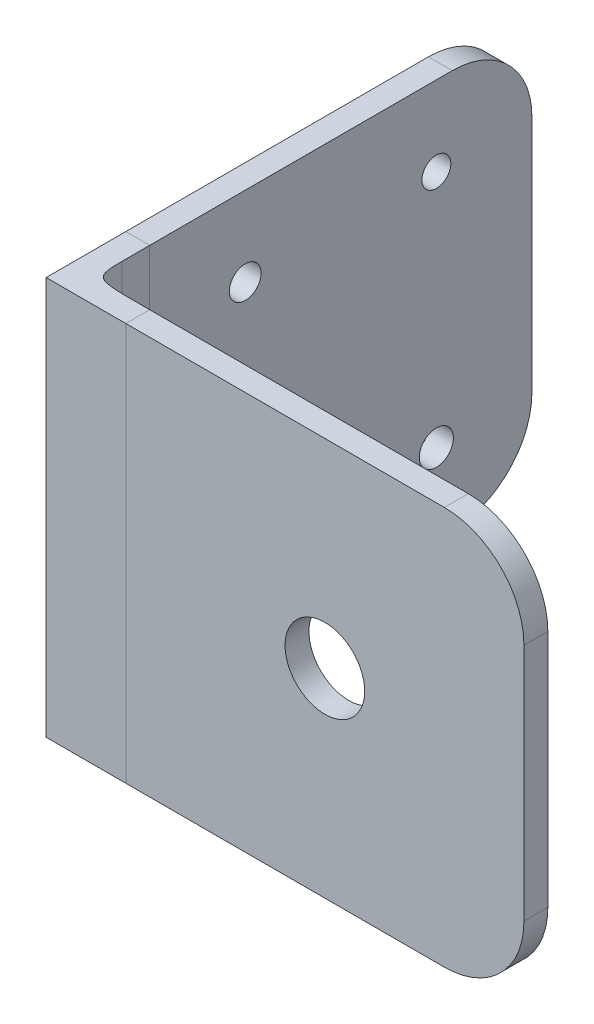
ISO-10303-21;
HEADER;
FILE_DESCRIPTION(('STEP AP214'),'2;1');
FILE_NAME('part.step','',(''),(''),'','','');
FILE_SCHEMA(('AUTOMOTIVE_DESIGN { 1 0 10303 214 1 1 1 1 }'));
ENDSEC;
DATA;
#1=APPLICATION_CONTEXT('core data for automotive mechanical design processes');
#2=APPLICATION_PROTOCOL_DEFINITION('international standard','automotive_design',2000,#1);
#3=PRODUCT_CONTEXT('',#1,'mechanical');
#4=PRODUCT('Part','Part','',(#3));
#5=PRODUCT_RELATED_PRODUCT_CATEGORY('part','',(#4));
#6=PRODUCT_DEFINITION_FORMATION('','',#4);
#7=PRODUCT_DEFINITION_CONTEXT('part definition',#1,'design');
#8=PRODUCT_DEFINITION('design','',#6,#7);
#9=PRODUCT_DEFINITION_SHAPE('','',#8);
#10=(LENGTH_UNIT() NAMED_UNIT(*) SI_UNIT(.MILLI.,.METRE.));
#11=(NAMED_UNIT(*) PLANE_ANGLE_UNIT() SI_UNIT($,.RADIAN.));
#12=(NAMED_UNIT(*) SI_UNIT($,.STERADIAN.) SOLID_ANGLE_UNIT());
#13=UNCERTAINTY_MEASURE_WITH_UNIT(LENGTH_MEASURE(1.E-05),#10,'distance_accuracy_value','');
#14=(GEOMETRIC_REPRESENTATION_CONTEXT(3) GLOBAL_UNCERTAINTY_ASSIGNED_CONTEXT((#13)) GLOBAL_UNIT_ASSIGNED_CONTEXT((#10,
#11,#12)) REPRESENTATION_CONTEXT('',''));
#15=CARTESIAN_POINT('',(0.,0.,0.));
#16=DIRECTION('',(0.,0.,1.));
#17=DIRECTION('',(1.,0.,0.));
#18=AXIS2_PLACEMENT_3D('',#15,#16,#17);
#19=CARTESIAN_POINT('',(-21.4649081505494,-14.4566204002042,5.00000000002137));
#20=DIRECTION('',(1.,0.,0.));
#21=DIRECTION('',(0.,0.,-1.));
#22=AXIS2_PLACEMENT_3D('',#19,#20,#21);
#23=PLANE('',#22);
#24=DIRECTION('',(0.,1.,0.));
#25=VECTOR('',#24,1.);
#26=CARTESIAN_POINT('',(-21.4649081505494,25.5433795997958,43.0000000000214));
#27=LINE('',#26,#25);
#28=CARTESIAN_POINT('',(-21.4649081505494,-24.4566204002042,43.0000000000214));
#29=VERTEX_POINT('',#28);
#30=CARTESIAN_POINT('',(-21.4649081505494,25.5433795997958,43.0000000000214));
#31=VERTEX_POINT('',#30);
#32=EDGE_CURVE('P0_E113',#29,#31,#27,.T.);
#33=ORIENTED_EDGE('',*,*,#32,.T.);
#34=DIRECTION('',(0.,0.,-1.));
#35=VECTOR('',#34,1.);
#36=CARTESIAN_POINT('',(-21.4649081505494,25.5433795997958,5.00000000002143));
#37=LINE('',#36,#35);
#38=CARTESIAN_POINT('',(-21.4649081505494,25.5433795997958,5.00000000002144));
#39=VERTEX_POINT('',#38);
#40=EDGE_CURVE('P0_E71',#31,#39,#37,.T.);
#41=ORIENTED_EDGE('',*,*,#40,.T.);
#42=CARTESIAN_POINT('',(-21.4649081505494,15.5433795997958,5.00000000002136));
#43=DIRECTION('',(-1.,0.,0.));
#44=DIRECTION('',(0.,0.,-1.));
#45=AXIS2_PLACEMENT_3D('',#42,#43,#44);
#46=CIRCLE('',#45,10.);
#47=CARTESIAN_POINT('',(-21.4649081505494,15.5433795997958,-4.99999999997864));
#48=VERTEX_POINT('',#47);
#49=EDGE_CURVE('P0_E84',#39,#48,#46,.T.);
#50=ORIENTED_EDGE('',*,*,#49,.T.);
#51=DIRECTION('',(0.,-1.,0.));
#52=VECTOR('',#51,1.);
#53=CARTESIAN_POINT('',(-21.4649081505494,15.5433795997958,-4.99999999997864));
#54=LINE('',#53,#52);
#55=CARTESIAN_POINT('',(-21.4649081505494,-14.4566204002042,-4.99999999997864));
#56=VERTEX_POINT('',#55);
#57=EDGE_CURVE('P0_E78',#48,#56,#54,.T.);
#58=ORIENTED_EDGE('',*,*,#57,.T.);
#59=CARTESIAN_POINT('',(-21.4649081505494,-14.4566204002042,5.00000000002137));
#60=DIRECTION('',(-1.,0.,0.));
#61=DIRECTION('',(0.,0.,-1.));
#62=AXIS2_PLACEMENT_3D('',#59,#60,#61);
#63=CIRCLE('',#62,10.);
#64=CARTESIAN_POINT('',(-21.4649081505494,-24.4566204002042,5.00000000002144));
#65=VERTEX_POINT('',#64);
#66=EDGE_CURVE('P0_E82',#56,#65,#63,.T.);
#67=ORIENTED_EDGE('',*,*,#66,.T.);
#68=DIRECTION('',(0.,0.,1.));
#69=VECTOR('',#68,1.);
#70=CARTESIAN_POINT('',(-21.4649081505494,-24.4566204002042,5.00000000002144));
#71=LINE('',#70,#69);
#72=EDGE_CURVE('P0_E34',#65,#29,#71,.T.);
#73=ORIENTED_EDGE('',*,*,#72,.T.);
#74=EDGE_LOOP('',(#33,#41,#50,#58,#67,#73));
#75=FACE_BOUND('',#74,.T.);
#76=CARTESIAN_POINT('',(-21.4649081505494,15.5433795997958,7.00000000002137));
#77=DIRECTION('',(-1.,0.,0.));
#78=DIRECTION('',(0.,0.,1.));
#79=AXIS2_PLACEMENT_3D('',#76,#77,#78);
#80=CIRCLE('',#79,1.8144674489946);
#81=CARTESIAN_POINT('',(-21.4649081505494,15.5433795997958,8.81446744901597));
#82=VERTEX_POINT('',#81);
#83=EDGE_CURVE('P0_E106',#82,#82,#80,.T.);
#84=ORIENTED_EDGE('',*,*,#83,.F.);
#85=EDGE_LOOP('',(#84));
#86=FACE_BOUND('',#85,.T.);
#87=CARTESIAN_POINT('',(-21.4649081505494,15.5433795997958,31.0000000000214));
#88=DIRECTION('',(-1.,0.,0.));
#89=DIRECTION('',(0.,0.,1.));
#90=AXIS2_PLACEMENT_3D('',#87,#88,#89);
#91=CIRCLE('',#90,1.99577898309595);
#92=CARTESIAN_POINT('',(-21.4649081505494,15.5433795997958,32.9957789831173));
#93=VERTEX_POINT('',#92);
#94=EDGE_CURVE('P0_E178',#93,#93,#91,.T.);
#95=ORIENTED_EDGE('',*,*,#94,.F.);
#96=EDGE_LOOP('',(#95));
#97=FACE_BOUND('',#96,.T.);
#98=CARTESIAN_POINT('',(-21.4649081505494,-14.4566204002042,7.00000000002137));
#99=DIRECTION('',(-1.,0.,0.));
#100=DIRECTION('',(0.,0.,1.));
#101=AXIS2_PLACEMENT_3D('',#98,#99,#100);
#102=CIRCLE('',#101,2.14187305226892);
#103=CARTESIAN_POINT('',(-21.4649081505494,-14.4566204002042,9.14187305229028));
#104=VERTEX_POINT('',#103);
#105=EDGE_CURVE('P0_E172',#104,#104,#102,.T.);
#106=ORIENTED_EDGE('',*,*,#105,.F.);
#107=EDGE_LOOP('',(#106));
#108=FACE_BOUND('',#107,.T.);
#109=CARTESIAN_POINT('',(-21.4649081505494,-14.4566204002042,31.0000000000214));
#110=DIRECTION('',(-1.,0.,0.));
#111=DIRECTION('',(0.,0.,1.));
#112=AXIS2_PLACEMENT_3D('',#109,#110,#111);
#113=CIRCLE('',#112,1.87301364959167);
#114=CARTESIAN_POINT('',(-21.4649081505494,-14.4566204002042,32.873013649613));
#115=VERTEX_POINT('',#114);
#116=EDGE_CURVE('P0_E163',#115,#115,#113,.T.);
#117=ORIENTED_EDGE('',*,*,#116,.F.);
#118=EDGE_LOOP('',(#117));
#119=FACE_BOUND('',#118,.T.);
#120=ADVANCED_FACE('P0_F17',(#75,#86,#97,#108,#119),#23,.F.);
#121=CARTESIAN_POINT('',(-18.4649081505494,-14.4566204002042,5.00000000002137));
#122=DIRECTION('',(1.,0.,0.));
#123=DIRECTION('',(0.,0.,-1.));
#124=AXIS2_PLACEMENT_3D('',#121,#122,#123);
#125=PLANE('',#124);
#126=CARTESIAN_POINT('',(-18.4649081505494,-14.4566204002042,7.00000000002137));
#127=DIRECTION('',(-1.,0.,0.));
#128=DIRECTION('',(0.,0.,1.));
#129=AXIS2_PLACEMENT_3D('',#126,#127,#128);
#130=CIRCLE('',#129,2.14187305226892);
#131=CARTESIAN_POINT('',(-18.4649081505494,-14.4566204002042,9.14187305229028));
#132=VERTEX_POINT('',#131);
#133=EDGE_CURVE('P0_E169',#132,#132,#130,.T.);
#134=ORIENTED_EDGE('',*,*,#133,.T.);
#135=EDGE_LOOP('',(#134));
#136=FACE_BOUND('',#135,.T.);
#137=CARTESIAN_POINT('',(-18.4649081505494,15.5433795997958,7.00000000002137));
#138=DIRECTION('',(-1.,0.,0.));
#139=DIRECTION('',(0.,0.,1.));
#140=AXIS2_PLACEMENT_3D('',#137,#138,#139);
#141=CIRCLE('',#140,1.8144674489946);
#142=CARTESIAN_POINT('',(-18.4649081505494,15.5433795997958,8.81446744901597));
#143=VERTEX_POINT('',#142);
#144=EDGE_CURVE('P0_E181',#143,#143,#141,.T.);
#145=ORIENTED_EDGE('',*,*,#144,.T.);
#146=EDGE_LOOP('',(#145));
#147=FACE_BOUND('',#146,.T.);
#148=DIRECTION('',(0.,1.,0.));
#149=VECTOR('',#148,1.);
#150=CARTESIAN_POINT('',(-18.4649081505494,25.5433795997958,43.0000000000214));
#151=LINE('',#150,#149);
#152=CARTESIAN_POINT('',(-18.4649081505494,-24.4566204002042,43.0000000000214));
#153=VERTEX_POINT('',#152);
#154=CARTESIAN_POINT('',(-18.4649081505494,25.5433795997958,43.0000000000214));
#155=VERTEX_POINT('',#154);
#156=EDGE_CURVE('P0_E102',#153,#155,#151,.T.);
#157=ORIENTED_EDGE('',*,*,#156,.F.);
#158=DIRECTION('',(0.,0.,1.));
#159=VECTOR('',#158,1.);
#160=CARTESIAN_POINT('',(-18.4649081505494,-24.4566204002042,5.00000000002144));
#161=LINE('',#160,#159);
#162=CARTESIAN_POINT('',(-18.4649081505494,-24.4566204002042,5.00000000002144));
#163=VERTEX_POINT('',#162);
#164=EDGE_CURVE('P0_E63',#163,#153,#161,.T.);
#165=ORIENTED_EDGE('',*,*,#164,.F.);
#166=CARTESIAN_POINT('',(-18.4649081505494,-14.4566204002042,5.00000000002137));
#167=DIRECTION('',(-1.,0.,0.));
#168=DIRECTION('',(0.,0.,-1.));
#169=AXIS2_PLACEMENT_3D('',#166,#167,#168);
#170=CIRCLE('',#169,10.);
#171=CARTESIAN_POINT('',(-18.4649081505494,-14.4566204002042,-4.99999999997864));
#172=VERTEX_POINT('',#171);
#173=EDGE_CURVE('P0_E57',#172,#163,#170,.T.);
#174=ORIENTED_EDGE('',*,*,#173,.F.);
#175=DIRECTION('',(0.,-1.,0.));
#176=VECTOR('',#175,1.);
#177=CARTESIAN_POINT('',(-18.4649081505494,15.5433795997958,-4.99999999997864));
#178=LINE('',#177,#176);
#179=CARTESIAN_POINT('',(-18.4649081505494,15.5433795997958,-4.99999999997864));
#180=VERTEX_POINT('',#179);
#181=EDGE_CURVE('P0_E92',#180,#172,#178,.T.);
#182=ORIENTED_EDGE('',*,*,#181,.F.);
#183=CARTESIAN_POINT('',(-18.4649081505494,15.5433795997958,5.00000000002136));
#184=DIRECTION('',(-1.,0.,0.));
#185=DIRECTION('',(0.,0.,-1.));
#186=AXIS2_PLACEMENT_3D('',#183,#184,#185);
#187=CIRCLE('',#186,10.);
#188=CARTESIAN_POINT('',(-18.4649081505494,25.5433795997958,5.00000000002143));
#189=VERTEX_POINT('',#188);
#190=EDGE_CURVE('P0_E108',#189,#180,#187,.T.);
#191=ORIENTED_EDGE('',*,*,#190,.F.);
#192=DIRECTION('',(0.,0.,-1.));
#193=VECTOR('',#192,1.);
#194=CARTESIAN_POINT('',(-18.4649081505494,25.5433795997958,5.00000000002143));
#195=LINE('',#194,#193);
#196=EDGE_CURVE('P0_E105',#155,#189,#195,.T.);
#197=ORIENTED_EDGE('',*,*,#196,.F.);
#198=EDGE_LOOP('',(#157,#165,#174,#182,#191,#197));
#199=FACE_BOUND('',#198,.T.);
#200=CARTESIAN_POINT('',(-18.4649081505494,15.5433795997958,31.0000000000214));
#201=DIRECTION('',(-1.,0.,0.));
#202=DIRECTION('',(0.,0.,1.));
#203=AXIS2_PLACEMENT_3D('',#200,#201,#202);
#204=CIRCLE('',#203,1.99577898309595);
#205=CARTESIAN_POINT('',(-18.4649081505494,15.5433795997958,32.9957789831173));
#206=VERTEX_POINT('',#205);
#207=EDGE_CURVE('P0_E175',#206,#206,#204,.T.);
#208=ORIENTED_EDGE('',*,*,#207,.T.);
#209=EDGE_LOOP('',(#208));
#210=FACE_BOUND('',#209,.T.);
#211=CARTESIAN_POINT('',(-18.4649081505494,-14.4566204002042,31.0000000000214));
#212=DIRECTION('',(-1.,0.,0.));
#213=DIRECTION('',(0.,0.,1.));
#214=AXIS2_PLACEMENT_3D('',#211,#212,#213);
#215=CIRCLE('',#214,1.87301364959167);
#216=CARTESIAN_POINT('',(-18.4649081505494,-14.4566204002042,32.873013649613));
#217=VERTEX_POINT('',#216);
#218=EDGE_CURVE('P0_E166',#217,#217,#215,.T.);
#219=ORIENTED_EDGE('',*,*,#218,.T.);
#220=EDGE_LOOP('',(#219));
#221=FACE_BOUND('',#220,.T.);
#222=ADVANCED_FACE('P0_F122',(#136,#147,#199,#210,#221),#125,.T.);
#223=CARTESIAN_POINT('',(-21.4649081505494,25.5433795997958,43.0000000000214));
#224=DIRECTION('',(0.,0.,-1.));
#225=DIRECTION('',(0.,-1.,0.));
#226=AXIS2_PLACEMENT_3D('',#223,#224,#225);
#227=PLANE('',#226);
#228=ORIENTED_EDGE('',*,*,#156,.T.);
#229=DIRECTION('',(1.,0.,0.));
#230=VECTOR('',#229,1.);
#231=CARTESIAN_POINT('',(-21.4649081505494,25.5433795997958,43.0000000000214));
#232=LINE('',#231,#230);
#233=EDGE_CURVE('P0_E11',#31,#155,#232,.T.);
#234=ORIENTED_EDGE('',*,*,#233,.F.);
#235=ORIENTED_EDGE('',*,*,#32,.F.);
#236=DIRECTION('',(1.,0.,0.));
#237=VECTOR('',#236,1.);
#238=CARTESIAN_POINT('',(-21.4649081505494,-24.4566204002042,43.0000000000214));
#239=LINE('',#238,#237);
#240=EDGE_CURVE('P0_E98',#29,#153,#239,.T.);
#241=ORIENTED_EDGE('',*,*,#240,.T.);
#242=EDGE_LOOP('',(#228,#234,#235,#241));
#243=FACE_BOUND('',#242,.T.);
#244=ADVANCED_FACE('P0_F19',(#243),#227,.F.);
#245=CARTESIAN_POINT('',(-21.4649081505494,25.5433795997958,5.00000000002143));
#246=DIRECTION('',(0.,-1.,0.));
#247=DIRECTION('',(1.,0.,0.));
#248=AXIS2_PLACEMENT_3D('',#245,#246,#247);
#249=PLANE('',#248);
#250=ORIENTED_EDGE('',*,*,#196,.T.);
#251=DIRECTION('',(1.,0.,0.));
#252=VECTOR('',#251,1.);
#253=CARTESIAN_POINT('',(-21.4649081505494,25.5433795997958,5.00000000002144));
#254=LINE('',#253,#252);
#255=EDGE_CURVE('P0_E26',#39,#189,#254,.T.);
#256=ORIENTED_EDGE('',*,*,#255,.F.);
#257=ORIENTED_EDGE('',*,*,#40,.F.);
#258=ORIENTED_EDGE('',*,*,#233,.T.);
#259=EDGE_LOOP('',(#250,#256,#257,#258));
#260=FACE_BOUND('',#259,.T.);
#261=ADVANCED_FACE('P0_F246',(#260),#249,.F.);
#262=CARTESIAN_POINT('',(-21.4649081505494,15.5433795997958,5.00000000002136));
#263=DIRECTION('',(1.,0.,0.));
#264=DIRECTION('',(0.,0.,-1.));
#265=AXIS2_PLACEMENT_3D('',#262,#263,#264);
#266=CYLINDRICAL_SURFACE('',#265,10.);
#267=ORIENTED_EDGE('',*,*,#190,.T.);
#268=DIRECTION('',(1.,0.,0.));
#269=VECTOR('',#268,1.);
#270=CARTESIAN_POINT('',(-21.4649081505494,15.5433795997958,-4.99999999997864));
#271=LINE('',#270,#269);
#272=EDGE_CURVE('P0_E93',#48,#180,#271,.T.);
#273=ORIENTED_EDGE('',*,*,#272,.F.);
#274=ORIENTED_EDGE('',*,*,#49,.F.);
#275=ORIENTED_EDGE('',*,*,#255,.T.);
#276=EDGE_LOOP('',(#267,#273,#274,#275));
#277=FACE_BOUND('',#276,.T.);
#278=ADVANCED_FACE('P0_F119',(#277),#266,.T.);
#279=CARTESIAN_POINT('',(-21.4649081505494,15.5433795997958,-4.99999999997864));
#280=DIRECTION('',(0.,0.,1.));
#281=DIRECTION('',(0.,1.,0.));
#282=AXIS2_PLACEMENT_3D('',#279,#280,#281);
#283=PLANE('',#282);
#284=ORIENTED_EDGE('',*,*,#181,.T.);
#285=DIRECTION('',(1.,0.,0.));
#286=VECTOR('',#285,1.);
#287=CARTESIAN_POINT('',(-21.4649081505494,-14.4566204002042,-4.99999999997864));
#288=LINE('',#287,#286);
#289=EDGE_CURVE('P0_E89',#56,#172,#288,.T.);
#290=ORIENTED_EDGE('',*,*,#289,.F.);
#291=ORIENTED_EDGE('',*,*,#57,.F.);
#292=ORIENTED_EDGE('',*,*,#272,.T.);
#293=EDGE_LOOP('',(#284,#290,#291,#292));
#294=FACE_BOUND('',#293,.T.);
#295=ADVANCED_FACE('P0_F90',(#294),#283,.F.);
#296=CARTESIAN_POINT('',(-21.4649081505494,-14.4566204002042,5.00000000002137));
#297=DIRECTION('',(1.,0.,0.));
#298=DIRECTION('',(0.,0.,-1.));
#299=AXIS2_PLACEMENT_3D('',#296,#297,#298);
#300=CYLINDRICAL_SURFACE('',#299,10.);
#301=ORIENTED_EDGE('',*,*,#173,.T.);
#302=DIRECTION('',(1.,0.,0.));
#303=VECTOR('',#302,1.);
#304=CARTESIAN_POINT('',(-21.4649081505494,-24.4566204002042,5.00000000002144));
#305=LINE('',#304,#303);
#306=EDGE_CURVE('P0_E94',#65,#163,#305,.T.);
#307=ORIENTED_EDGE('',*,*,#306,.F.);
#308=ORIENTED_EDGE('',*,*,#66,.F.);
#309=ORIENTED_EDGE('',*,*,#289,.T.);
#310=EDGE_LOOP('',(#301,#307,#308,#309));
#311=FACE_BOUND('',#310,.T.);
#312=ADVANCED_FACE('P0_F96',(#311),#300,.T.);
#313=CARTESIAN_POINT('',(-21.4649081505494,-24.4566204002042,5.00000000002144));
#314=DIRECTION('',(0.,1.,0.));
#315=DIRECTION('',(-1.,0.,0.));
#316=AXIS2_PLACEMENT_3D('',#313,#314,#315);
#317=PLANE('',#316);
#318=ORIENTED_EDGE('',*,*,#164,.T.);
#319=ORIENTED_EDGE('',*,*,#240,.F.);
#320=ORIENTED_EDGE('',*,*,#72,.F.);
#321=ORIENTED_EDGE('',*,*,#306,.T.);
#322=EDGE_LOOP('',(#318,#319,#320,#321));
#323=FACE_BOUND('',#322,.T.);
#324=ADVANCED_FACE('P0_F127',(#323),#317,.F.);
#325=CARTESIAN_POINT('',(-21.4649081505494,15.5433795997958,7.00000000002137));
#326=DIRECTION('',(1.,0.,0.));
#327=DIRECTION('',(0.,0.,-1.));
#328=AXIS2_PLACEMENT_3D('',#325,#326,#327);
#329=CYLINDRICAL_SURFACE('',#328,1.8144674489946);
#330=ORIENTED_EDGE('',*,*,#83,.T.);
#331=EDGE_LOOP('',(#330));
#332=FACE_BOUND('',#331,.T.);
#333=ORIENTED_EDGE('',*,*,#144,.F.);
#334=EDGE_LOOP('',(#333));
#335=FACE_BOUND('',#334,.T.);
#336=ADVANCED_FACE('P0_F129',(#332,#335),#329,.F.);
#337=CARTESIAN_POINT('',(-21.4649081505494,15.5433795997958,31.0000000000214));
#338=DIRECTION('',(1.,0.,0.));
#339=DIRECTION('',(0.,0.,-1.));
#340=AXIS2_PLACEMENT_3D('',#337,#338,#339);
#341=CYLINDRICAL_SURFACE('',#340,1.99577898309595);
#342=ORIENTED_EDGE('',*,*,#94,.T.);
#343=EDGE_LOOP('',(#342));
#344=FACE_BOUND('',#343,.T.);
#345=ORIENTED_EDGE('',*,*,#207,.F.);
#346=EDGE_LOOP('',(#345));
#347=FACE_BOUND('',#346,.T.);
#348=ADVANCED_FACE('P0_F136',(#344,#347),#341,.F.);
#349=CARTESIAN_POINT('',(-21.4649081505494,-14.4566204002042,7.00000000002137));
#350=DIRECTION('',(1.,0.,0.));
#351=DIRECTION('',(0.,0.,-1.));
#352=AXIS2_PLACEMENT_3D('',#349,#350,#351);
#353=CYLINDRICAL_SURFACE('',#352,2.14187305226892);
#354=ORIENTED_EDGE('',*,*,#105,.T.);
#355=EDGE_LOOP('',(#354));
#356=FACE_BOUND('',#355,.T.);
#357=ORIENTED_EDGE('',*,*,#133,.F.);
#358=EDGE_LOOP('',(#357));
#359=FACE_BOUND('',#358,.T.);
#360=ADVANCED_FACE('P0_F150',(#356,#359),#353,.F.);
#361=CARTESIAN_POINT('',(-21.4649081505494,-14.4566204002042,31.0000000000214));
#362=DIRECTION('',(1.,0.,0.));
#363=DIRECTION('',(0.,0.,-1.));
#364=AXIS2_PLACEMENT_3D('',#361,#362,#363);
#365=CYLINDRICAL_SURFACE('',#364,1.87301364959167);
#366=ORIENTED_EDGE('',*,*,#116,.T.);
#367=EDGE_LOOP('',(#366));
#368=FACE_BOUND('',#367,.T.);
#369=ORIENTED_EDGE('',*,*,#218,.F.);
#370=EDGE_LOOP('',(#369));
#371=FACE_BOUND('',#370,.T.);
#372=ADVANCED_FACE('P0_F154',(#368,#371),#365,.F.);
#373=CLOSED_SHELL('',(#120,#222,#244,#261,#278,#295,#312,#324,#336,#348,#360,#372));
#374=MANIFOLD_SOLID_BREP('P0_B1',#373);
#375=CARTESIAN_POINT('',(-18.4649081505494,-24.4566204002042,24.57142857145));
#376=DIRECTION('',(1.,0.,0.));
#377=DIRECTION('',(0.,-1.,0.));
#378=AXIS2_PLACEMENT_3D('',#375,#376,#377);
#379=PLANE('',#378);
#380=DIRECTION('',(0.,0.,-1.));
#381=VECTOR('',#380,1.);
#382=CARTESIAN_POINT('',(-18.4649081505494,25.5433795997958,24.57142857145));
#383=LINE('',#382,#381);
#384=CARTESIAN_POINT('',(-18.4649081505494,25.5433795997958,46.5000000000214));
#385=VERTEX_POINT('',#384);
#386=CARTESIAN_POINT('',(-18.4649081505494,25.5433795997958,43.0000000000214));
#387=VERTEX_POINT('',#386);
#388=EDGE_CURVE('P1_E105',#385,#387,#383,.T.);
#389=ORIENTED_EDGE('',*,*,#388,.F.);
#390=DIRECTION('',(0.,1.,0.));
#391=VECTOR('',#390,1.);
#392=CARTESIAN_POINT('',(-18.4649081505494,-24.4566204002042,46.5000000000214));
#393=LINE('',#392,#391);
#394=CARTESIAN_POINT('',(-18.4649081505494,-24.4566204002042,46.5000000000214));
#395=VERTEX_POINT('',#394);
#396=EDGE_CURVE('P1_E11',#395,#385,#393,.T.);
#397=ORIENTED_EDGE('',*,*,#396,.F.);
#398=DIRECTION('',(0.,0.,-1.));
#399=VECTOR('',#398,1.);
#400=CARTESIAN_POINT('',(-18.4649081505494,-24.4566204002042,24.57142857145));
#401=LINE('',#400,#399);
#402=CARTESIAN_POINT('',(-18.4649081505494,-24.4566204002042,43.0000000000214));
#403=VERTEX_POINT('',#402);
#404=EDGE_CURVE('P1_E127',#395,#403,#401,.T.);
#405=ORIENTED_EDGE('',*,*,#404,.T.);
#406=DIRECTION('',(0.,1.,0.));
#407=VECTOR('',#406,1.);
#408=CARTESIAN_POINT('',(-18.4649081505494,-24.4566204002042,43.0000000000214));
#409=LINE('',#408,#407);
#410=EDGE_CURVE('P1_E64',#403,#387,#409,.T.);
#411=ORIENTED_EDGE('',*,*,#410,.T.);
#412=EDGE_LOOP('',(#389,#397,#405,#411));
#413=FACE_BOUND('',#412,.T.);
#414=ADVANCED_FACE('P1_F17',(#413),#379,.T.);
#415=CARTESIAN_POINT('',(-18.4649081505494,-24.4566204002042,46.5000000000214));
#416=CARTESIAN_POINT('',(-18.4896667516624,-24.4566204002042,49.4034072236731));
#417=CARTESIAN_POINT('',(-18.1130730094793,-24.4566204002042,49.8294641635294));
#418=CARTESIAN_POINT('',(-15.1084168723432,-24.4566204002042,50.001313593285));
#419=CARTESIAN_POINT('',(-14.7110921304511,-24.4566204002042,50.0036302965063));
#420=CARTESIAN_POINT('',(-14.6003163891629,-24.4566204002042,50.0000000000214));
#421=B_SPLINE_CURVE_WITH_KNOTS('',3,(#415,#416,#417,#418,#419,#420),.UNSPECIFIED.,.F.,.F.,(4,1,
1,4),(0.,0.274480378204325,0.306299738792352,0.31819360588027),.UNSPECIFIED.);
#422=DIRECTION('',(0.,1.,0.));
#423=VECTOR('',#422,1.);
#424=SURFACE_OF_LINEAR_EXTRUSION('',#421,#423);
#425=CARTESIAN_POINT('',(-18.4649081505494,25.5433795997958,46.5000000000214));
#426=CARTESIAN_POINT('',(-18.4896667516624,25.5433795997958,49.4034072236731));
#427=CARTESIAN_POINT('',(-18.1130730094793,25.5433795997958,49.8294641635294));
#428=CARTESIAN_POINT('',(-15.1084168723432,25.5433795997958,50.001313593285));
#429=CARTESIAN_POINT('',(-14.7110921304511,25.5433795997958,50.0036302965063));
#430=CARTESIAN_POINT('',(-14.6003163891629,25.5433795997958,50.0000000000214));
#431=B_SPLINE_CURVE_WITH_KNOTS('',3,(#425,#426,#427,#428,#429,#430),.UNSPECIFIED.,.F.,.F.,(4,1,
1,4),(0.,0.274480378204325,0.306299738792352,0.31819360588027),.UNSPECIFIED.);
#432=CARTESIAN_POINT('',(-14.6003163891629,25.5433795997958,50.0000000000214));
#433=VERTEX_POINT('',#432);
#434=EDGE_CURVE('P1_E108',#385,#433,#431,.T.);
#435=ORIENTED_EDGE('',*,*,#434,.T.);
#436=DIRECTION('',(0.,1.,0.));
#437=VECTOR('',#436,1.);
#438=CARTESIAN_POINT('',(-14.6003163891629,-24.4566204002042,50.0000000000214));
#439=LINE('',#438,#437);
#440=CARTESIAN_POINT('',(-14.6003163891629,-24.4566204002042,50.0000000000214));
#441=VERTEX_POINT('',#440);
#442=EDGE_CURVE('P1_E25',#441,#433,#439,.T.);
#443=ORIENTED_EDGE('',*,*,#442,.F.);
#444=EDGE_CURVE('P1_E146',#395,#441,#421,.T.);
#445=ORIENTED_EDGE('',*,*,#444,.F.);
#446=ORIENTED_EDGE('',*,*,#396,.T.);
#447=EDGE_LOOP('',(#435,#443,#445,#446));
#448=FACE_BOUND('',#447,.T.);
#449=ADVANCED_FACE('P1_F140',(#448),#424,.F.);
#450=CARTESIAN_POINT('',(-13.4649081505497,-24.4566204002042,50.0000000000214));
#451=DIRECTION('',(0.,0.,-1.));
#452=DIRECTION('',(1.,0.,0.));
#453=AXIS2_PLACEMENT_3D('',#450,#451,#452);
#454=PLANE('',#453);
#455=DIRECTION('',(-1.,0.,0.));
#456=VECTOR('',#455,1.);
#457=CARTESIAN_POINT('',(-13.4649081505497,25.5433795997958,50.0000000000214));
#458=LINE('',#457,#456);
#459=CARTESIAN_POINT('',(-11.4649081505494,25.5433795997958,50.0000000000214));
#460=VERTEX_POINT('',#459);
#461=EDGE_CURVE('P1_E113',#460,#433,#458,.T.);
#462=ORIENTED_EDGE('',*,*,#461,.F.);
#463=DIRECTION('',(0.,1.,0.));
#464=VECTOR('',#463,1.);
#465=CARTESIAN_POINT('',(-11.4649081505494,-24.4566204002042,50.0000000000214));
#466=LINE('',#465,#464);
#467=CARTESIAN_POINT('',(-11.4649081505494,-24.4566204002042,50.0000000000214));
#468=VERTEX_POINT('',#467);
#469=EDGE_CURVE('P1_E131',#468,#460,#466,.T.);
#470=ORIENTED_EDGE('',*,*,#469,.F.);
#471=DIRECTION('',(-1.,0.,0.));
#472=VECTOR('',#471,1.);
#473=CARTESIAN_POINT('',(-13.4649081505497,-24.4566204002042,50.0000000000214));
#474=LINE('',#473,#472);
#475=EDGE_CURVE('P1_E137',#468,#441,#474,.T.);
#476=ORIENTED_EDGE('',*,*,#475,.T.);
#477=ORIENTED_EDGE('',*,*,#442,.T.);
#478=EDGE_LOOP('',(#462,#470,#476,#477));
#479=FACE_BOUND('',#478,.T.);
#480=ADVANCED_FACE('P1_F136',(#479),#454,.T.);
#481=CARTESIAN_POINT('',(-11.4649081505494,-24.4566204002042,24.57142857145));
#482=DIRECTION('',(1.,0.,0.));
#483=DIRECTION('',(0.,-1.,0.));
#484=AXIS2_PLACEMENT_3D('',#481,#482,#483);
#485=PLANE('',#484);
#486=DIRECTION('',(0.,0.,-1.));
#487=VECTOR('',#486,1.);
#488=CARTESIAN_POINT('',(-11.4649081505494,25.5433795997958,24.57142857145));
#489=LINE('',#488,#487);
#490=CARTESIAN_POINT('',(-11.4649081505494,25.5433795997958,53.0000000000214));
#491=VERTEX_POINT('',#490);
#492=EDGE_CURVE('P1_E119',#491,#460,#489,.T.);
#493=ORIENTED_EDGE('',*,*,#492,.F.);
#494=DIRECTION('',(0.,1.,0.));
#495=VECTOR('',#494,1.);
#496=CARTESIAN_POINT('',(-11.4649081505494,-24.4566204002042,53.0000000000214));
#497=LINE('',#496,#495);
#498=CARTESIAN_POINT('',(-11.4649081505494,-24.4566204002042,53.0000000000214));
#499=VERTEX_POINT('',#498);
#500=EDGE_CURVE('P1_E98',#499,#491,#497,.T.);
#501=ORIENTED_EDGE('',*,*,#500,.F.);
#502=DIRECTION('',(0.,0.,-1.));
#503=VECTOR('',#502,1.);
#504=CARTESIAN_POINT('',(-11.4649081505494,-24.4566204002042,24.57142857145));
#505=LINE('',#504,#503);
#506=EDGE_CURVE('P1_E87',#499,#468,#505,.T.);
#507=ORIENTED_EDGE('',*,*,#506,.T.);
#508=ORIENTED_EDGE('',*,*,#469,.T.);
#509=EDGE_LOOP('',(#493,#501,#507,#508));
#510=FACE_BOUND('',#509,.T.);
#511=ADVANCED_FACE('P1_F145',(#510),#485,.T.);
#512=CARTESIAN_POINT('',(-13.4649081505494,-24.4566204002042,53.0000000000214));
#513=DIRECTION('',(0.,0.,-1.));
#514=DIRECTION('',(0.,-1.,0.));
#515=AXIS2_PLACEMENT_3D('',#512,#513,#514);
#516=PLANE('',#515);
#517=DIRECTION('',(-1.,0.,0.));
#518=VECTOR('',#517,1.);
#519=CARTESIAN_POINT('',(-13.4649081505494,25.5433795997958,53.0000000000214));
#520=LINE('',#519,#518);
#521=CARTESIAN_POINT('',(-21.4649081505494,25.5433795997958,53.0000000000214));
#522=VERTEX_POINT('',#521);
#523=EDGE_CURVE('P1_E94',#491,#522,#520,.T.);
#524=ORIENTED_EDGE('',*,*,#523,.T.);
#525=DIRECTION('',(0.,1.,0.));
#526=VECTOR('',#525,1.);
#527=CARTESIAN_POINT('',(-21.4649081505494,-24.4566204002042,53.0000000000214));
#528=LINE('',#527,#526);
#529=CARTESIAN_POINT('',(-21.4649081505494,-24.4566204002042,53.0000000000214));
#530=VERTEX_POINT('',#529);
#531=EDGE_CURVE('P1_E91',#530,#522,#528,.T.);
#532=ORIENTED_EDGE('',*,*,#531,.F.);
#533=DIRECTION('',(-1.,0.,0.));
#534=VECTOR('',#533,1.);
#535=CARTESIAN_POINT('',(-13.4649081505494,-24.4566204002042,53.0000000000214));
#536=LINE('',#535,#534);
#537=EDGE_CURVE('P1_E80',#499,#530,#536,.T.);
#538=ORIENTED_EDGE('',*,*,#537,.F.);
#539=ORIENTED_EDGE('',*,*,#500,.T.);
#540=EDGE_LOOP('',(#524,#532,#538,#539));
#541=FACE_BOUND('',#540,.T.);
#542=ADVANCED_FACE('P1_F92',(#541),#516,.F.);
#543=CARTESIAN_POINT('',(-21.4649081505494,-24.4566204002042,24.57142857145));
#544=DIRECTION('',(-1.,0.,0.));
#545=DIRECTION('',(0.,0.,-1.));
#546=AXIS2_PLACEMENT_3D('',#543,#544,#545);
#547=PLANE('',#546);
#548=DIRECTION('',(0.,0.,1.));
#549=VECTOR('',#548,1.);
#550=CARTESIAN_POINT('',(-21.4649081505494,25.5433795997958,24.57142857145));
#551=LINE('',#550,#549);
#552=CARTESIAN_POINT('',(-21.4649081505494,25.5433795997958,43.0000000000214));
#553=VERTEX_POINT('',#552);
#554=EDGE_CURVE('P1_E123',#553,#522,#551,.T.);
#555=ORIENTED_EDGE('',*,*,#554,.F.);
#556=DIRECTION('',(0.,1.,0.));
#557=VECTOR('',#556,1.);
#558=CARTESIAN_POINT('',(-21.4649081505494,-24.4566204002042,43.0000000000214));
#559=LINE('',#558,#557);
#560=CARTESIAN_POINT('',(-21.4649081505494,-24.4566204002042,43.0000000000214));
#561=VERTEX_POINT('',#560);
#562=EDGE_CURVE('P1_E57',#561,#553,#559,.T.);
#563=ORIENTED_EDGE('',*,*,#562,.F.);
#564=DIRECTION('',(0.,0.,1.));
#565=VECTOR('',#564,1.);
#566=CARTESIAN_POINT('',(-21.4649081505494,-24.4566204002042,24.57142857145));
#567=LINE('',#566,#565);
#568=EDGE_CURVE('P1_E84',#561,#530,#567,.T.);
#569=ORIENTED_EDGE('',*,*,#568,.T.);
#570=ORIENTED_EDGE('',*,*,#531,.T.);
#571=EDGE_LOOP('',(#555,#563,#569,#570));
#572=FACE_BOUND('',#571,.T.);
#573=ADVANCED_FACE('P1_F100',(#572),#547,.T.);
#574=CARTESIAN_POINT('',(-13.4649081505494,-24.4566204002042,43.0000000000214));
#575=DIRECTION('',(0.,0.,1.));
#576=DIRECTION('',(0.,1.,0.));
#577=AXIS2_PLACEMENT_3D('',#574,#575,#576);
#578=PLANE('',#577);
#579=DIRECTION('',(1.,0.,0.));
#580=VECTOR('',#579,1.);
#581=CARTESIAN_POINT('',(-13.4649081505494,25.5433795997958,43.0000000000214));
#582=LINE('',#581,#580);
#583=EDGE_CURVE('P1_E125',#553,#387,#582,.T.);
#584=ORIENTED_EDGE('',*,*,#583,.T.);
#585=ORIENTED_EDGE('',*,*,#410,.F.);
#586=DIRECTION('',(1.,0.,0.));
#587=VECTOR('',#586,1.);
#588=CARTESIAN_POINT('',(-13.4649081505494,-24.4566204002042,43.0000000000214));
#589=LINE('',#588,#587);
#590=EDGE_CURVE('P1_E33',#561,#403,#589,.T.);
#591=ORIENTED_EDGE('',*,*,#590,.F.);
#592=ORIENTED_EDGE('',*,*,#562,.T.);
#593=EDGE_LOOP('',(#584,#585,#591,#592));
#594=FACE_BOUND('',#593,.T.);
#595=ADVANCED_FACE('P1_F166',(#594),#578,.F.);
#596=CARTESIAN_POINT('',(-13.4649081505494,-24.4566204002042,24.57142857145));
#597=DIRECTION('',(0.,-1.,0.));
#598=DIRECTION('',(-1.,0.,0.));
#599=AXIS2_PLACEMENT_3D('',#596,#597,#598);
#600=PLANE('',#599);
#601=ORIENTED_EDGE('',*,*,#404,.F.);
#602=ORIENTED_EDGE('',*,*,#444,.T.);
#603=ORIENTED_EDGE('',*,*,#475,.F.);
#604=ORIENTED_EDGE('',*,*,#506,.F.);
#605=ORIENTED_EDGE('',*,*,#537,.T.);
#606=ORIENTED_EDGE('',*,*,#568,.F.);
#607=ORIENTED_EDGE('',*,*,#590,.T.);
#608=EDGE_LOOP('',(#601,#602,#603,#604,#605,#606,#607));
#609=FACE_BOUND('',#608,.T.);
#610=ADVANCED_FACE('P1_F82',(#609),#600,.T.);
#611=CARTESIAN_POINT('',(-13.4649081505494,25.5433795997958,24.57142857145));
#612=DIRECTION('',(0.,-1.,0.));
#613=DIRECTION('',(-1.,0.,0.));
#614=AXIS2_PLACEMENT_3D('',#611,#612,#613);
#615=PLANE('',#614);
#616=ORIENTED_EDGE('',*,*,#388,.T.);
#617=ORIENTED_EDGE('',*,*,#583,.F.);
#618=ORIENTED_EDGE('',*,*,#554,.T.);
#619=ORIENTED_EDGE('',*,*,#523,.F.);
#620=ORIENTED_EDGE('',*,*,#492,.T.);
#621=ORIENTED_EDGE('',*,*,#461,.T.);
#622=ORIENTED_EDGE('',*,*,#434,.F.);
#623=EDGE_LOOP('',(#616,#617,#618,#619,#620,#621,#622));
#624=FACE_BOUND('',#623,.T.);
#625=ADVANCED_FACE('P1_F142',(#624),#615,.F.);
#626=CLOSED_SHELL('',(#414,#449,#480,#511,#542,#573,#595,#610,#625));
#627=MANIFOLD_SOLID_BREP('P1_B1',#626);
#628=CARTESIAN_POINT('',(28.5350918494507,-14.4566204002042,53.0000000000214));
#629=DIRECTION('',(0.,0.,1.));
#630=DIRECTION('',(1.,0.,0.));
#631=AXIS2_PLACEMENT_3D('',#628,#629,#630);
#632=PLANE('',#631);
#633=DIRECTION('',(0.,-1.,0.));
#634=VECTOR('',#633,1.);
#635=CARTESIAN_POINT('',(-11.4649081505493,25.5433795997958,53.0000000000214));
#636=LINE('',#635,#634);
#637=CARTESIAN_POINT('',(-11.4649081505493,25.5433795997958,53.0000000000214));
#638=VERTEX_POINT('',#637);
#639=CARTESIAN_POINT('',(-11.4649081505493,-24.4566204002042,53.0000000000214));
#640=VERTEX_POINT('',#639);
#641=EDGE_CURVE('P2_E125',#638,#640,#636,.T.);
#642=ORIENTED_EDGE('',*,*,#641,.T.);
#643=DIRECTION('',(1.,0.,0.));
#644=VECTOR('',#643,1.);
#645=CARTESIAN_POINT('',(-11.4649081505493,-24.4566204002042,53.0000000000214));
#646=LINE('',#645,#644);
#647=CARTESIAN_POINT('',(28.5350918494507,-24.4566204002042,53.0000000000214));
#648=VERTEX_POINT('',#647);
#649=EDGE_CURVE('P2_E72',#640,#648,#646,.T.);
#650=ORIENTED_EDGE('',*,*,#649,.T.);
#651=CARTESIAN_POINT('',(28.5350918494507,-14.4566204002042,53.0000000000214));
#652=DIRECTION('',(0.,0.,1.));
#653=DIRECTION('',(1.,0.,0.));
#654=AXIS2_PLACEMENT_3D('',#651,#652,#653);
#655=CIRCLE('',#654,10.);
#656=CARTESIAN_POINT('',(38.5350918494507,-14.4566204002042,53.0000000000214));
#657=VERTEX_POINT('',#656);
#658=EDGE_CURVE('P2_E85',#648,#657,#655,.T.);
#659=ORIENTED_EDGE('',*,*,#658,.T.);
#660=DIRECTION('',(0.,1.,0.));
#661=VECTOR('',#660,1.);
#662=CARTESIAN_POINT('',(38.5350918494507,15.5433795997958,53.0000000000214));
#663=LINE('',#662,#661);
#664=CARTESIAN_POINT('',(38.5350918494507,15.5433795997958,53.0000000000214));
#665=VERTEX_POINT('',#664);
#666=EDGE_CURVE('P2_E79',#657,#665,#663,.T.);
#667=ORIENTED_EDGE('',*,*,#666,.T.);
#668=CARTESIAN_POINT('',(28.5350918494507,15.5433795997958,53.0000000000214));
#669=DIRECTION('',(0.,0.,1.));
#670=DIRECTION('',(1.,0.,0.));
#671=AXIS2_PLACEMENT_3D('',#668,#669,#670);
#672=CIRCLE('',#671,10.);
#673=CARTESIAN_POINT('',(28.5350918494507,25.5433795997958,53.0000000000214));
#674=VERTEX_POINT('',#673);
#675=EDGE_CURVE('P2_E83',#665,#674,#672,.T.);
#676=ORIENTED_EDGE('',*,*,#675,.T.);
#677=DIRECTION('',(-1.,0.,0.));
#678=VECTOR('',#677,1.);
#679=CARTESIAN_POINT('',(-11.4649081505493,25.5433795997958,53.0000000000214));
#680=LINE('',#679,#678);
#681=EDGE_CURVE('P2_E35',#674,#638,#680,.T.);
#682=ORIENTED_EDGE('',*,*,#681,.T.);
#683=EDGE_LOOP('',(#642,#650,#659,#667,#676,#682));
#684=FACE_BOUND('',#683,.T.);
#685=CARTESIAN_POINT('',(13.5350918494507,0.543379599795823,53.0000000000214));
#686=DIRECTION('',(0.,0.,1.));
#687=DIRECTION('',(1.,0.,0.));
#688=AXIS2_PLACEMENT_3D('',#685,#686,#687);
#689=CIRCLE('',#688,5.);
#690=CARTESIAN_POINT('',(18.5350918494507,0.543379599795823,53.0000000000214));
#691=VERTEX_POINT('',#690);
#692=EDGE_CURVE('P2_E113',#691,#691,#689,.T.);
#693=ORIENTED_EDGE('',*,*,#692,.F.);
#694=EDGE_LOOP('',(#693));
#695=FACE_BOUND('',#694,.T.);
#696=ADVANCED_FACE('P2_F17',(#684,#695),#632,.T.);
#697=CARTESIAN_POINT('',(28.5350918494507,-14.4566204002042,50.0000000000214));
#698=DIRECTION('',(0.,0.,1.));
#699=DIRECTION('',(1.,0.,0.));
#700=AXIS2_PLACEMENT_3D('',#697,#698,#699);
#701=PLANE('',#700);
#702=DIRECTION('',(0.,-1.,0.));
#703=VECTOR('',#702,1.);
#704=CARTESIAN_POINT('',(-11.4649081505493,25.5433795997958,50.0000000000214));
#705=LINE('',#704,#703);
#706=CARTESIAN_POINT('',(-11.4649081505493,25.5433795997958,50.0000000000214));
#707=VERTEX_POINT('',#706);
#708=CARTESIAN_POINT('',(-11.4649081505493,-24.4566204002042,50.0000000000214));
#709=VERTEX_POINT('',#708);
#710=EDGE_CURVE('P2_E108',#707,#709,#705,.T.);
#711=ORIENTED_EDGE('',*,*,#710,.F.);
#712=DIRECTION('',(-1.,0.,0.));
#713=VECTOR('',#712,1.);
#714=CARTESIAN_POINT('',(-11.4649081505493,25.5433795997958,50.0000000000214));
#715=LINE('',#714,#713);
#716=CARTESIAN_POINT('',(28.5350918494507,25.5433795997958,50.0000000000214));
#717=VERTEX_POINT('',#716);
#718=EDGE_CURVE('P2_E64',#717,#707,#715,.T.);
#719=ORIENTED_EDGE('',*,*,#718,.F.);
#720=CARTESIAN_POINT('',(28.5350918494507,15.5433795997958,50.0000000000214));
#721=DIRECTION('',(0.,0.,1.));
#722=DIRECTION('',(1.,0.,0.));
#723=AXIS2_PLACEMENT_3D('',#720,#721,#722);
#724=CIRCLE('',#723,10.);
#725=CARTESIAN_POINT('',(38.5350918494507,15.5433795997958,50.0000000000214));
#726=VERTEX_POINT('',#725);
#727=EDGE_CURVE('P2_E58',#726,#717,#724,.T.);
#728=ORIENTED_EDGE('',*,*,#727,.F.);
#729=DIRECTION('',(0.,1.,0.));
#730=VECTOR('',#729,1.);
#731=CARTESIAN_POINT('',(38.5350918494507,15.5433795997958,50.0000000000214));
#732=LINE('',#731,#730);
#733=CARTESIAN_POINT('',(38.5350918494507,-14.4566204002042,50.0000000000214));
#734=VERTEX_POINT('',#733);
#735=EDGE_CURVE('P2_E94',#734,#726,#732,.T.);
#736=ORIENTED_EDGE('',*,*,#735,.F.);
#737=CARTESIAN_POINT('',(28.5350918494507,-14.4566204002042,50.0000000000214));
#738=DIRECTION('',(0.,0.,1.));
#739=DIRECTION('',(1.,0.,0.));
#740=AXIS2_PLACEMENT_3D('',#737,#738,#739);
#741=CIRCLE('',#740,10.);
#742=CARTESIAN_POINT('',(28.5350918494507,-24.4566204002042,50.0000000000214));
#743=VERTEX_POINT('',#742);
#744=EDGE_CURVE('P2_E116',#743,#734,#741,.T.);
#745=ORIENTED_EDGE('',*,*,#744,.F.);
#746=DIRECTION('',(1.,0.,0.));
#747=VECTOR('',#746,1.);
#748=CARTESIAN_POINT('',(-11.4649081505493,-24.4566204002042,50.0000000000214));
#749=LINE('',#748,#747);
#750=EDGE_CURVE('P2_E112',#709,#743,#749,.T.);
#751=ORIENTED_EDGE('',*,*,#750,.F.);
#752=EDGE_LOOP('',(#711,#719,#728,#736,#745,#751));
#753=FACE_BOUND('',#752,.T.);
#754=CARTESIAN_POINT('',(13.5350918494507,0.543379599795823,50.0000000000214));
#755=DIRECTION('',(0.,0.,1.));
#756=DIRECTION('',(1.,0.,0.));
#757=AXIS2_PLACEMENT_3D('',#754,#755,#756);
#758=CIRCLE('',#757,5.);
#759=CARTESIAN_POINT('',(18.5350918494507,0.543379599795823,50.0000000000214));
#760=VERTEX_POINT('',#759);
#761=EDGE_CURVE('P2_E230',#760,#760,#758,.T.);
#762=ORIENTED_EDGE('',*,*,#761,.T.);
#763=EDGE_LOOP('',(#762));
#764=FACE_BOUND('',#763,.T.);
#765=ADVANCED_FACE('P2_F138',(#753,#764),#701,.F.);
#766=CARTESIAN_POINT('',(-11.4649081505493,25.5433795997958,53.0000000000214));
#767=DIRECTION('',(1.,0.,0.));
#768=DIRECTION('',(0.,1.,0.));
#769=AXIS2_PLACEMENT_3D('',#766,#767,#768);
#770=PLANE('',#769);
#771=ORIENTED_EDGE('',*,*,#710,.T.);
#772=DIRECTION('',(0.,0.,-1.));
#773=VECTOR('',#772,1.);
#774=CARTESIAN_POINT('',(-11.4649081505493,-24.4566204002042,53.0000000000214));
#775=LINE('',#774,#773);
#776=EDGE_CURVE('P2_E11',#640,#709,#775,.T.);
#777=ORIENTED_EDGE('',*,*,#776,.F.);
#778=ORIENTED_EDGE('',*,*,#641,.F.);
#779=DIRECTION('',(0.,0.,-1.));
#780=VECTOR('',#779,1.);
#781=CARTESIAN_POINT('',(-11.4649081505493,25.5433795997958,53.0000000000214));
#782=LINE('',#781,#780);
#783=EDGE_CURVE('P2_E104',#638,#707,#782,.T.);
#784=ORIENTED_EDGE('',*,*,#783,.T.);
#785=EDGE_LOOP('',(#771,#777,#778,#784));
#786=FACE_BOUND('',#785,.T.);
#787=ADVANCED_FACE('P2_F19',(#786),#770,.F.);
#788=CARTESIAN_POINT('',(-11.4649081505493,-24.4566204002042,53.0000000000214));
#789=DIRECTION('',(0.,1.,0.));
#790=DIRECTION('',(0.,0.,1.));
#791=AXIS2_PLACEMENT_3D('',#788,#789,#790);
#792=PLANE('',#791);
#793=ORIENTED_EDGE('',*,*,#750,.T.);
#794=DIRECTION('',(0.,0.,-1.));
#795=VECTOR('',#794,1.);
#796=CARTESIAN_POINT('',(28.5350918494507,-24.4566204002042,53.0000000000214));
#797=LINE('',#796,#795);
#798=EDGE_CURVE('P2_E27',#648,#743,#797,.T.);
#799=ORIENTED_EDGE('',*,*,#798,.F.);
#800=ORIENTED_EDGE('',*,*,#649,.F.);
#801=ORIENTED_EDGE('',*,*,#776,.T.);
#802=EDGE_LOOP('',(#793,#799,#800,#801));
#803=FACE_BOUND('',#802,.T.);
#804=ADVANCED_FACE('P2_F164',(#803),#792,.F.);
#805=CARTESIAN_POINT('',(28.5350918494507,-14.4566204002042,53.0000000000214));
#806=DIRECTION('',(0.,0.,-1.));
#807=DIRECTION('',(-1.,0.,0.));
#808=AXIS2_PLACEMENT_3D('',#805,#806,#807);
#809=CYLINDRICAL_SURFACE('',#808,10.);
#810=ORIENTED_EDGE('',*,*,#744,.T.);
#811=DIRECTION('',(0.,0.,-1.));
#812=VECTOR('',#811,1.);
#813=CARTESIAN_POINT('',(38.5350918494507,-14.4566204002042,53.0000000000214));
#814=LINE('',#813,#812);
#815=EDGE_CURVE('P2_E96',#657,#734,#814,.T.);
#816=ORIENTED_EDGE('',*,*,#815,.F.);
#817=ORIENTED_EDGE('',*,*,#658,.F.);
#818=ORIENTED_EDGE('',*,*,#798,.T.);
#819=EDGE_LOOP('',(#810,#816,#817,#818));
#820=FACE_BOUND('',#819,.T.);
#821=ADVANCED_FACE('P2_F135',(#820),#809,.T.);
#822=CARTESIAN_POINT('',(38.5350918494507,15.5433795997958,53.0000000000214));
#823=DIRECTION('',(-1.,0.,0.));
#824=DIRECTION('',(0.,-1.,0.));
#825=AXIS2_PLACEMENT_3D('',#822,#823,#824);
#826=PLANE('',#825);
#827=ORIENTED_EDGE('',*,*,#735,.T.);
#828=DIRECTION('',(0.,0.,-1.));
#829=VECTOR('',#828,1.);
#830=CARTESIAN_POINT('',(38.5350918494507,15.5433795997958,53.0000000000214));
#831=LINE('',#830,#829);
#832=EDGE_CURVE('P2_E91',#665,#726,#831,.T.);
#833=ORIENTED_EDGE('',*,*,#832,.F.);
#834=ORIENTED_EDGE('',*,*,#666,.F.);
#835=ORIENTED_EDGE('',*,*,#815,.T.);
#836=EDGE_LOOP('',(#827,#833,#834,#835));
#837=FACE_BOUND('',#836,.T.);
#838=ADVANCED_FACE('P2_F92',(#837),#826,.F.);
#839=CARTESIAN_POINT('',(28.5350918494507,15.5433795997958,53.0000000000214));
#840=DIRECTION('',(0.,0.,-1.));
#841=DIRECTION('',(-1.,0.,0.));
#842=AXIS2_PLACEMENT_3D('',#839,#840,#841);
#843=CYLINDRICAL_SURFACE('',#842,10.);
#844=ORIENTED_EDGE('',*,*,#727,.T.);
#845=DIRECTION('',(0.,0.,-1.));
#846=VECTOR('',#845,1.);
#847=CARTESIAN_POINT('',(28.5350918494507,25.5433795997958,53.0000000000214));
#848=LINE('',#847,#846);
#849=EDGE_CURVE('P2_E97',#674,#717,#848,.T.);
#850=ORIENTED_EDGE('',*,*,#849,.F.);
#851=ORIENTED_EDGE('',*,*,#675,.F.);
#852=ORIENTED_EDGE('',*,*,#832,.T.);
#853=EDGE_LOOP('',(#844,#850,#851,#852));
#854=FACE_BOUND('',#853,.T.);
#855=ADVANCED_FACE('P2_F99',(#854),#843,.T.);
#856=CARTESIAN_POINT('',(-11.4649081505493,25.5433795997958,53.0000000000214));
#857=DIRECTION('',(0.,-1.,0.));
#858=DIRECTION('',(0.,0.,-1.));
#859=AXIS2_PLACEMENT_3D('',#856,#857,#858);
#860=PLANE('',#859);
#861=ORIENTED_EDGE('',*,*,#718,.T.);
#862=ORIENTED_EDGE('',*,*,#783,.F.);
#863=ORIENTED_EDGE('',*,*,#681,.F.);
#864=ORIENTED_EDGE('',*,*,#849,.T.);
#865=EDGE_LOOP('',(#861,#862,#863,#864));
#866=FACE_BOUND('',#865,.T.);
#867=ADVANCED_FACE('P2_F143',(#866),#860,.F.);
#868=CARTESIAN_POINT('',(13.5350918494507,0.543379599795823,53.0000000000214));
#869=DIRECTION('',(0.,0.,-1.));
#870=DIRECTION('',(-1.,0.,0.));
#871=AXIS2_PLACEMENT_3D('',#868,#869,#870);
#872=CYLINDRICAL_SURFACE('',#871,5.);
#873=ORIENTED_EDGE('',*,*,#692,.T.);
#874=EDGE_LOOP('',(#873));
#875=FACE_BOUND('',#874,.T.);
#876=ORIENTED_EDGE('',*,*,#761,.F.);
#877=EDGE_LOOP('',(#876));
#878=FACE_BOUND('',#877,.T.);
#879=ADVANCED_FACE('P2_F145',(#875,#878),#872,.F.);
#880=CLOSED_SHELL('',(#696,#765,#787,#804,#821,#838,#855,#867,#879));
#881=MANIFOLD_SOLID_BREP('P2_B1',#880);
#882=ADVANCED_BREP_SHAPE_REPRESENTATION('',(#18,#374,#627,#881),#14);
#883=SHAPE_DEFINITION_REPRESENTATION(#9,#882);
ENDSEC;
END-ISO-10303-21;
